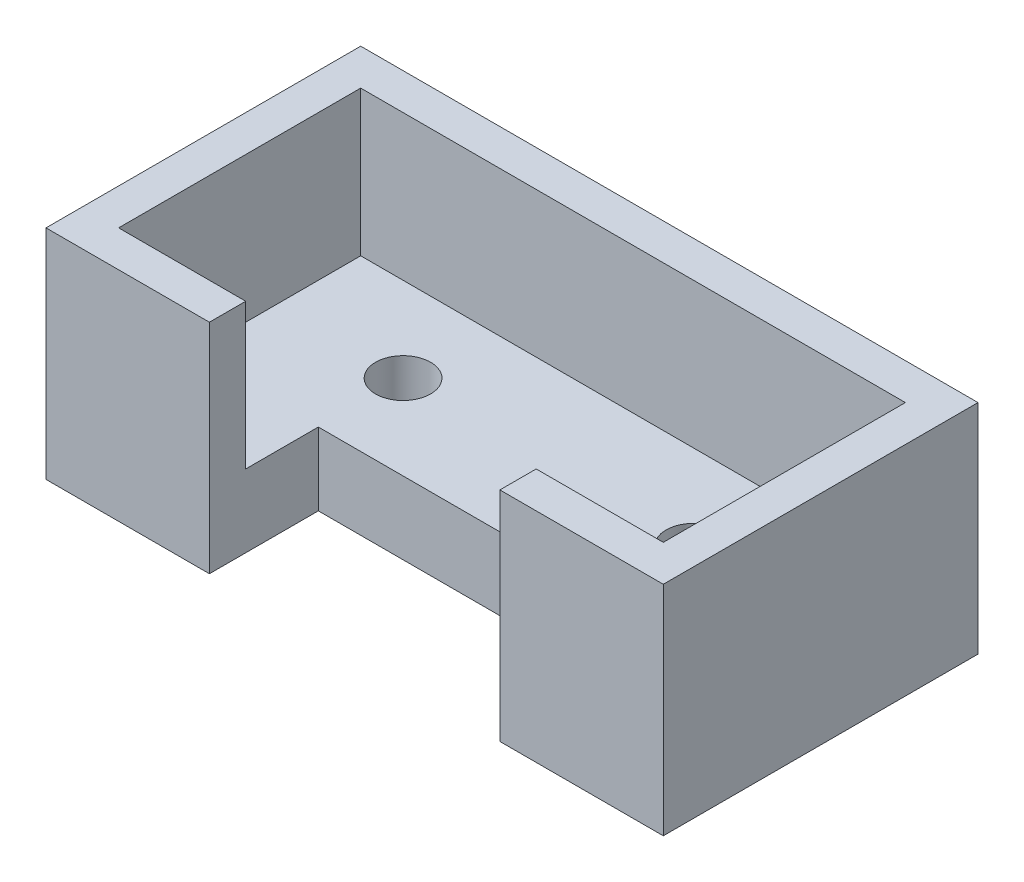
ISO-10303-21;
HEADER;
FILE_DESCRIPTION(('STEP AP214'),'2;1');
FILE_NAME('part.step','',(''),(''),'','','');
FILE_SCHEMA(('AUTOMOTIVE_DESIGN { 1 0 10303 214 1 1 1 1 }'));
ENDSEC;
DATA;
#1=APPLICATION_CONTEXT('core data for automotive mechanical design processes');
#2=APPLICATION_PROTOCOL_DEFINITION('international standard','automotive_design',2000,#1);
#3=PRODUCT_CONTEXT('',#1,'mechanical');
#4=PRODUCT('Part','Part','',(#3));
#5=PRODUCT_RELATED_PRODUCT_CATEGORY('part','',(#4));
#6=PRODUCT_DEFINITION_FORMATION('','',#4);
#7=PRODUCT_DEFINITION_CONTEXT('part definition',#1,'design');
#8=PRODUCT_DEFINITION('design','',#6,#7);
#9=PRODUCT_DEFINITION_SHAPE('','',#8);
#10=(LENGTH_UNIT() NAMED_UNIT(*) SI_UNIT(.MILLI.,.METRE.));
#11=(NAMED_UNIT(*) PLANE_ANGLE_UNIT() SI_UNIT($,.RADIAN.));
#12=(NAMED_UNIT(*) SI_UNIT($,.STERADIAN.) SOLID_ANGLE_UNIT());
#13=UNCERTAINTY_MEASURE_WITH_UNIT(LENGTH_MEASURE(1.E-05),#10,'distance_accuracy_value','');
#14=(GEOMETRIC_REPRESENTATION_CONTEXT(3) GLOBAL_UNCERTAINTY_ASSIGNED_CONTEXT((#13)) GLOBAL_UNIT_ASSIGNED_CONTEXT((#10,
#11,#12)) REPRESENTATION_CONTEXT('',''));
#15=CARTESIAN_POINT('',(0.,0.,0.));
#16=DIRECTION('',(0.,0.,1.));
#17=DIRECTION('',(1.,0.,0.));
#18=AXIS2_PLACEMENT_3D('',#15,#16,#17);
#19=CARTESIAN_POINT('',(-22.6041971247564,-3.3,7.43055555555555));
#20=DIRECTION('',(0.,0.,1.));
#21=DIRECTION('',(1.,0.,0.));
#22=AXIS2_PLACEMENT_3D('',#19,#20,#21);
#23=PLANE('',#22);
#24=DIRECTION('',(1.,0.,0.));
#25=VECTOR('',#24,1.);
#26=CARTESIAN_POINT('',(-22.6041971247564,-3.3,7.43055555555555));
#27=LINE('',#26,#25);
#28=CARTESIAN_POINT('',(14.8958028752436,-3.3,7.43055555555555));
#29=VERTEX_POINT('',#28);
#30=CARTESIAN_POINT('',(25.3958028752436,-3.3,7.43055555555555));
#31=VERTEX_POINT('',#30);
#32=EDGE_CURVE('E218',#29,#31,#27,.T.);
#33=ORIENTED_EDGE('',*,*,#32,.F.);
#34=DIRECTION('',(0.,1.,0.));
#35=VECTOR('',#34,1.);
#36=CARTESIAN_POINT('',(14.8958028752436,8.70000000000001,7.43055555555555));
#37=LINE('',#36,#35);
#38=CARTESIAN_POINT('',(14.8958028752436,8.70000000000001,7.43055555555555));
#39=VERTEX_POINT('',#38);
#40=EDGE_CURVE('E51',#29,#39,#37,.T.);
#41=ORIENTED_EDGE('',*,*,#40,.T.);
#42=DIRECTION('',(1.,0.,0.));
#43=VECTOR('',#42,1.);
#44=CARTESIAN_POINT('',(-22.6041971247564,8.7,7.43055555555555));
#45=LINE('',#44,#43);
#46=CARTESIAN_POINT('',(25.3958028752436,8.7,7.43055555555555));
#47=VERTEX_POINT('',#46);
#48=EDGE_CURVE('E223',#39,#47,#45,.T.);
#49=ORIENTED_EDGE('',*,*,#48,.T.);
#50=DIRECTION('',(0.,-1.,0.));
#51=VECTOR('',#50,1.);
#52=CARTESIAN_POINT('',(25.3958028752436,-3.3,7.43055555555555));
#53=LINE('',#52,#51);
#54=EDGE_CURVE('E58',#47,#31,#53,.T.);
#55=ORIENTED_EDGE('',*,*,#54,.T.);
#56=EDGE_LOOP('',(#33,#41,#49,#55));
#57=FACE_BOUND('',#56,.T.);
#58=ADVANCED_FACE('F36',(#57),#23,.F.);
#59=CARTESIAN_POINT('',(28.3958028752436,-3.3,10.4305555555556));
#60=DIRECTION('',(0.,0.,-1.));
#61=DIRECTION('',(-1.,0.,0.));
#62=AXIS2_PLACEMENT_3D('',#59,#60,#61);
#63=PLANE('',#62);
#64=DIRECTION('',(-1.,0.,0.));
#65=VECTOR('',#64,1.);
#66=CARTESIAN_POINT('',(28.3958028752436,8.7,10.4305555555556));
#67=LINE('',#66,#65);
#68=CARTESIAN_POINT('',(28.3958028752436,8.7,10.4305555555556));
#69=VERTEX_POINT('',#68);
#70=CARTESIAN_POINT('',(14.8958028752436,8.70000000000001,10.4305555555556));
#71=VERTEX_POINT('',#70);
#72=EDGE_CURVE('E44',#69,#71,#67,.T.);
#73=ORIENTED_EDGE('',*,*,#72,.T.);
#74=DIRECTION('',(0.,1.,0.));
#75=VECTOR('',#74,1.);
#76=CARTESIAN_POINT('',(14.8958028752436,8.70000000000001,10.4305555555556));
#77=LINE('',#76,#75);
#78=CARTESIAN_POINT('',(14.8958028752436,-9.3,10.4305555555556));
#79=VERTEX_POINT('',#78);
#80=EDGE_CURVE('E196',#79,#71,#77,.T.);
#81=ORIENTED_EDGE('',*,*,#80,.F.);
#82=DIRECTION('',(1.,0.,0.));
#83=VECTOR('',#82,1.);
#84=CARTESIAN_POINT('',(0.,-9.3,10.4305555555556));
#85=LINE('',#84,#83);
#86=CARTESIAN_POINT('',(28.3958028752436,-9.3,10.4305555555556));
#87=VERTEX_POINT('',#86);
#88=EDGE_CURVE('E162',#79,#87,#85,.T.);
#89=ORIENTED_EDGE('',*,*,#88,.T.);
#90=DIRECTION('',(0.,-1.,0.));
#91=VECTOR('',#90,1.);
#92=CARTESIAN_POINT('',(28.3958028752436,-3.3,10.4305555555556));
#93=LINE('',#92,#91);
#94=EDGE_CURVE('E161',#69,#87,#93,.T.);
#95=ORIENTED_EDGE('',*,*,#94,.F.);
#96=EDGE_LOOP('',(#73,#81,#89,#95));
#97=FACE_BOUND('',#96,.T.);
#98=ADVANCED_FACE('F274',(#97),#63,.F.);
#99=CARTESIAN_POINT('',(-22.6041971247564,-3.3,-12.5694444444444));
#100=DIRECTION('',(0.,0.,-1.));
#101=DIRECTION('',(-1.,0.,0.));
#102=AXIS2_PLACEMENT_3D('',#99,#100,#101);
#103=PLANE('',#102);
#104=DIRECTION('',(0.,1.,0.));
#105=VECTOR('',#104,1.);
#106=CARTESIAN_POINT('',(-19.6041971247563,-3.3,-12.5694444444444));
#107=LINE('',#106,#105);
#108=CARTESIAN_POINT('',(-19.6041971247563,-3.3,-12.5694444444444));
#109=VERTEX_POINT('',#108);
#110=CARTESIAN_POINT('',(-19.6041971247563,8.7,-12.5694444444444));
#111=VERTEX_POINT('',#110);
#112=EDGE_CURVE('E204',#109,#111,#107,.T.);
#113=ORIENTED_EDGE('',*,*,#112,.F.);
#114=DIRECTION('',(1.,0.,0.));
#115=VECTOR('',#114,1.);
#116=CARTESIAN_POINT('',(-22.6041971247564,-3.3,-12.5694444444444));
#117=LINE('',#116,#115);
#118=CARTESIAN_POINT('',(25.3958028752436,-3.30000000000001,-12.5694444444444));
#119=VERTEX_POINT('',#118);
#120=EDGE_CURVE('E237',#109,#119,#117,.T.);
#121=ORIENTED_EDGE('',*,*,#120,.T.);
#122=DIRECTION('',(0.,1.,0.));
#123=VECTOR('',#122,1.);
#124=CARTESIAN_POINT('',(25.3958028752436,-3.3,-12.5694444444444));
#125=LINE('',#124,#123);
#126=CARTESIAN_POINT('',(25.3958028752436,8.7,-12.5694444444444));
#127=VERTEX_POINT('',#126);
#128=EDGE_CURVE('E227',#119,#127,#125,.T.);
#129=ORIENTED_EDGE('',*,*,#128,.T.);
#130=DIRECTION('',(1.,0.,0.));
#131=VECTOR('',#130,1.);
#132=CARTESIAN_POINT('',(-22.6041971247564,8.7,-12.5694444444444));
#133=LINE('',#132,#131);
#134=EDGE_CURVE('E233',#111,#127,#133,.T.);
#135=ORIENTED_EDGE('',*,*,#134,.F.);
#136=EDGE_LOOP('',(#113,#121,#129,#135));
#137=FACE_BOUND('',#136,.T.);
#138=ADVANCED_FACE('F279',(#137),#103,.F.);
#139=CARTESIAN_POINT('',(-19.6041971247563,8.7,7.43055555557248));
#140=VERTEX_POINT('',#139);
#141=CARTESIAN_POINT('',(-9.10419712475635,8.7,7.43055555555555));
#142=VERTEX_POINT('',#141);
#143=EDGE_CURVE('E224',#140,#142,#45,.T.);
#144=ORIENTED_EDGE('',*,*,#143,.T.);
#145=DIRECTION('',(0.,-1.,0.));
#146=VECTOR('',#145,1.);
#147=CARTESIAN_POINT('',(-9.10419712475635,-3.3,7.43055555555555));
#148=LINE('',#147,#146);
#149=CARTESIAN_POINT('',(-9.10419712475635,-3.3,7.43055555556402));
#150=VERTEX_POINT('',#149);
#151=EDGE_CURVE('E194',#142,#150,#148,.T.);
#152=ORIENTED_EDGE('',*,*,#151,.T.);
#153=CARTESIAN_POINT('',(-19.6041971247563,-3.3,7.43055555557248));
#154=VERTEX_POINT('',#153);
#155=EDGE_CURVE('E220',#154,#150,#27,.T.);
#156=ORIENTED_EDGE('',*,*,#155,.F.);
#157=DIRECTION('',(0.,1.,0.));
#158=VECTOR('',#157,1.);
#159=CARTESIAN_POINT('',(-19.6041971247563,-3.3,7.43055555557248));
#160=LINE('',#159,#158);
#161=EDGE_CURVE('E211',#154,#140,#160,.T.);
#162=ORIENTED_EDGE('',*,*,#161,.T.);
#163=EDGE_LOOP('',(#144,#152,#156,#162));
#164=FACE_BOUND('',#163,.T.);
#165=ADVANCED_FACE('F275',(#164),#23,.F.);
#166=CARTESIAN_POINT('',(25.3958028752436,0.,0.));
#167=DIRECTION('',(-1.,0.,0.));
#168=DIRECTION('',(0.,0.,1.));
#169=AXIS2_PLACEMENT_3D('',#166,#167,#168);
#170=PLANE('',#169);
#171=DIRECTION('',(0.,0.,-1.));
#172=VECTOR('',#171,1.);
#173=CARTESIAN_POINT('',(25.3958028752436,-3.3,7.43055555555555));
#174=LINE('',#173,#172);
#175=EDGE_CURVE('E146',#31,#119,#174,.T.);
#176=ORIENTED_EDGE('',*,*,#175,.F.);
#177=ORIENTED_EDGE('',*,*,#54,.F.);
#178=DIRECTION('',(0.,0.,1.));
#179=VECTOR('',#178,1.);
#180=CARTESIAN_POINT('',(25.3958028752436,8.7,10.4305555555556));
#181=LINE('',#180,#179);
#182=EDGE_CURVE('E238',#127,#47,#181,.T.);
#183=ORIENTED_EDGE('',*,*,#182,.F.);
#184=ORIENTED_EDGE('',*,*,#128,.F.);
#185=EDGE_LOOP('',(#176,#177,#183,#184));
#186=FACE_BOUND('',#185,.T.);
#187=ADVANCED_FACE('F282',(#186),#170,.T.);
#188=CARTESIAN_POINT('',(28.3958028752436,-3.3,-15.5694444444444));
#189=DIRECTION('',(0.,0.,1.));
#190=DIRECTION('',(1.,0.,0.));
#191=AXIS2_PLACEMENT_3D('',#188,#189,#190);
#192=PLANE('',#191);
#193=DIRECTION('',(0.,1.,0.));
#194=VECTOR('',#193,1.);
#195=CARTESIAN_POINT('',(28.3958028752436,-3.3,-15.5694444444444));
#196=LINE('',#195,#194);
#197=CARTESIAN_POINT('',(28.3958028752436,-9.3,-15.5694444444444));
#198=VERTEX_POINT('',#197);
#199=CARTESIAN_POINT('',(28.3958028752436,8.7,-15.5694444444444));
#200=VERTEX_POINT('',#199);
#201=EDGE_CURVE('E137',#198,#200,#196,.T.);
#202=ORIENTED_EDGE('',*,*,#201,.F.);
#203=DIRECTION('',(-1.,0.,0.));
#204=VECTOR('',#203,1.);
#205=CARTESIAN_POINT('',(0.,-9.3,-15.5694444444444));
#206=LINE('',#205,#204);
#207=CARTESIAN_POINT('',(-22.6041971247564,-9.3,-15.5694444444444));
#208=VERTEX_POINT('',#207);
#209=EDGE_CURVE('E140',#198,#208,#206,.T.);
#210=ORIENTED_EDGE('',*,*,#209,.T.);
#211=DIRECTION('',(0.,-1.,0.));
#212=VECTOR('',#211,1.);
#213=CARTESIAN_POINT('',(-22.6041971247564,8.7,-15.5694444444444));
#214=LINE('',#213,#212);
#215=CARTESIAN_POINT('',(-22.6041971247564,8.7,-15.5694444444444));
#216=VERTEX_POINT('',#215);
#217=EDGE_CURVE('E231',#216,#208,#214,.T.);
#218=ORIENTED_EDGE('',*,*,#217,.F.);
#219=DIRECTION('',(-1.,0.,0.));
#220=VECTOR('',#219,1.);
#221=CARTESIAN_POINT('',(28.3958028752436,8.7,-15.5694444444444));
#222=LINE('',#221,#220);
#223=EDGE_CURVE('E11',#200,#216,#222,.T.);
#224=ORIENTED_EDGE('',*,*,#223,.F.);
#225=EDGE_LOOP('',(#202,#210,#218,#224));
#226=FACE_BOUND('',#225,.T.);
#227=ADVANCED_FACE('F38',(#226),#192,.F.);
#228=CARTESIAN_POINT('',(28.3958028752436,8.7,10.4305555555556));
#229=DIRECTION('',(0.,-1.,0.));
#230=DIRECTION('',(0.,0.,-1.));
#231=AXIS2_PLACEMENT_3D('',#228,#229,#230);
#232=PLANE('',#231);
#233=ORIENTED_EDGE('',*,*,#48,.F.);
#234=DIRECTION('',(0.,0.,1.));
#235=VECTOR('',#234,1.);
#236=CARTESIAN_POINT('',(14.8958028752436,8.70000000000001,7.43055555555555));
#237=LINE('',#236,#235);
#238=EDGE_CURVE('E201',#39,#71,#237,.T.);
#239=ORIENTED_EDGE('',*,*,#238,.T.);
#240=ORIENTED_EDGE('',*,*,#72,.F.);
#241=DIRECTION('',(0.,0.,1.));
#242=VECTOR('',#241,1.);
#243=CARTESIAN_POINT('',(28.3958028752436,8.7,-15.5694444444444));
#244=LINE('',#243,#242);
#245=EDGE_CURVE('E145',#200,#69,#244,.T.);
#246=ORIENTED_EDGE('',*,*,#245,.F.);
#247=ORIENTED_EDGE('',*,*,#223,.T.);
#248=DIRECTION('',(0.,0.,-1.));
#249=VECTOR('',#248,1.);
#250=CARTESIAN_POINT('',(-22.6041971247564,8.7,-12.5694444444444));
#251=LINE('',#250,#249);
#252=CARTESIAN_POINT('',(-22.6041971247564,8.7,10.4305555555556));
#253=VERTEX_POINT('',#252);
#254=EDGE_CURVE('E228',#253,#216,#251,.T.);
#255=ORIENTED_EDGE('',*,*,#254,.F.);
#256=CARTESIAN_POINT('',(-9.10419712475635,8.7,10.4305555555556));
#257=VERTEX_POINT('',#256);
#258=EDGE_CURVE('E242',#257,#253,#67,.T.);
#259=ORIENTED_EDGE('',*,*,#258,.F.);
#260=DIRECTION('',(0.,0.,1.));
#261=VECTOR('',#260,1.);
#262=CARTESIAN_POINT('',(-9.10419712475635,8.7,7.43055555555555));
#263=LINE('',#262,#261);
#264=EDGE_CURVE('E198',#142,#257,#263,.T.);
#265=ORIENTED_EDGE('',*,*,#264,.F.);
#266=ORIENTED_EDGE('',*,*,#143,.F.);
#267=DIRECTION('',(0.,0.,-1.));
#268=VECTOR('',#267,1.);
#269=CARTESIAN_POINT('',(-19.6041971247563,8.7,500000.));
#270=LINE('',#269,#268);
#271=EDGE_CURVE('E208',#140,#111,#270,.T.);
#272=ORIENTED_EDGE('',*,*,#271,.T.);
#273=ORIENTED_EDGE('',*,*,#134,.T.);
#274=ORIENTED_EDGE('',*,*,#182,.T.);
#275=EDGE_LOOP('',(#233,#239,#240,#246,#247,#255,#259,#265,#266,#272,#273,#274));
#276=FACE_BOUND('',#275,.T.);
#277=ADVANCED_FACE('F257',(#276),#232,.F.);
#278=DIRECTION('',(0.,1.,0.));
#279=VECTOR('',#278,1.);
#280=CARTESIAN_POINT('',(-22.6041971247564,8.7,10.4305555555556));
#281=LINE('',#280,#279);
#282=CARTESIAN_POINT('',(-22.6041971247564,-9.3,10.4305555555556));
#283=VERTEX_POINT('',#282);
#284=EDGE_CURVE('E215',#283,#253,#281,.T.);
#285=ORIENTED_EDGE('',*,*,#284,.F.);
#286=DIRECTION('',(1.,0.,0.));
#287=VECTOR('',#286,1.);
#288=CARTESIAN_POINT('',(0.,-9.3,10.4305555555556));
#289=LINE('',#288,#287);
#290=CARTESIAN_POINT('',(-9.10419712475635,-9.3,10.4305555555556));
#291=VERTEX_POINT('',#290);
#292=EDGE_CURVE('E176',#283,#291,#289,.T.);
#293=ORIENTED_EDGE('',*,*,#292,.T.);
#294=DIRECTION('',(0.,-1.,0.));
#295=VECTOR('',#294,1.);
#296=CARTESIAN_POINT('',(-9.10419712475635,-3.3,10.4305555555556));
#297=LINE('',#296,#295);
#298=EDGE_CURVE('E193',#257,#291,#297,.T.);
#299=ORIENTED_EDGE('',*,*,#298,.F.);
#300=ORIENTED_EDGE('',*,*,#258,.T.);
#301=EDGE_LOOP('',(#285,#293,#299,#300));
#302=FACE_BOUND('',#301,.T.);
#303=ADVANCED_FACE('F253',(#302),#63,.F.);
#304=CARTESIAN_POINT('',(28.3958028752436,0.,0.));
#305=DIRECTION('',(-1.,0.,0.));
#306=DIRECTION('',(0.,0.,1.));
#307=AXIS2_PLACEMENT_3D('',#304,#305,#306);
#308=PLANE('',#307);
#309=ORIENTED_EDGE('',*,*,#94,.T.);
#310=DIRECTION('',(0.,0.,-1.));
#311=VECTOR('',#310,1.);
#312=CARTESIAN_POINT('',(28.3958028752436,-9.3,0.));
#313=LINE('',#312,#311);
#314=EDGE_CURVE('E152',#87,#198,#313,.T.);
#315=ORIENTED_EDGE('',*,*,#314,.T.);
#316=ORIENTED_EDGE('',*,*,#201,.T.);
#317=ORIENTED_EDGE('',*,*,#245,.T.);
#318=EDGE_LOOP('',(#309,#315,#316,#317));
#319=FACE_BOUND('',#318,.T.);
#320=ADVANCED_FACE('F159',(#319),#308,.F.);
#321=CARTESIAN_POINT('',(-22.6041971247564,0.,0.));
#322=DIRECTION('',(-1.,0.,0.));
#323=DIRECTION('',(0.,0.,1.));
#324=AXIS2_PLACEMENT_3D('',#321,#322,#323);
#325=PLANE('',#324);
#326=ORIENTED_EDGE('',*,*,#254,.T.);
#327=ORIENTED_EDGE('',*,*,#217,.T.);
#328=DIRECTION('',(0.,0.,1.));
#329=VECTOR('',#328,1.);
#330=CARTESIAN_POINT('',(-22.6041971247564,-9.3,0.));
#331=LINE('',#330,#329);
#332=EDGE_CURVE('E156',#208,#283,#331,.T.);
#333=ORIENTED_EDGE('',*,*,#332,.T.);
#334=ORIENTED_EDGE('',*,*,#284,.T.);
#335=EDGE_LOOP('',(#326,#327,#333,#334));
#336=FACE_BOUND('',#335,.T.);
#337=ADVANCED_FACE('F259',(#336),#325,.T.);
#338=CARTESIAN_POINT('',(-19.6041971247563,-3.3,500000.));
#339=DIRECTION('',(-1.,0.,0.));
#340=DIRECTION('',(0.,0.,1.));
#341=AXIS2_PLACEMENT_3D('',#338,#339,#340);
#342=PLANE('',#341);
#343=ORIENTED_EDGE('',*,*,#161,.F.);
#344=DIRECTION('',(0.,0.,-1.));
#345=VECTOR('',#344,1.);
#346=CARTESIAN_POINT('',(-19.6041971247563,-3.3,500000.));
#347=LINE('',#346,#345);
#348=EDGE_CURVE('E209',#154,#109,#347,.T.);
#349=ORIENTED_EDGE('',*,*,#348,.T.);
#350=ORIENTED_EDGE('',*,*,#112,.T.);
#351=ORIENTED_EDGE('',*,*,#271,.F.);
#352=EDGE_LOOP('',(#343,#349,#350,#351));
#353=FACE_BOUND('',#352,.T.);
#354=ADVANCED_FACE('F261',(#353),#342,.F.);
#355=CARTESIAN_POINT('',(-9.10419712475635,-3.3,7.43055555555555));
#356=DIRECTION('',(-1.,0.,0.));
#357=DIRECTION('',(0.,0.,1.));
#358=AXIS2_PLACEMENT_3D('',#355,#356,#357);
#359=PLANE('',#358);
#360=ORIENTED_EDGE('',*,*,#298,.T.);
#361=DIRECTION('',(0.,0.,-1.));
#362=VECTOR('',#361,1.);
#363=CARTESIAN_POINT('',(-9.10419712475634,-9.3,0.));
#364=LINE('',#363,#362);
#365=CARTESIAN_POINT('',(-9.10419712475635,-9.3,1.43055555555555));
#366=VERTEX_POINT('',#365);
#367=EDGE_CURVE('E173',#291,#366,#364,.T.);
#368=ORIENTED_EDGE('',*,*,#367,.T.);
#369=DIRECTION('',(0.,1.,0.));
#370=VECTOR('',#369,1.);
#371=CARTESIAN_POINT('',(-9.10419712475635,-9.3,1.43055555555555));
#372=LINE('',#371,#370);
#373=CARTESIAN_POINT('',(-9.10419712475635,-3.3,1.43055555555555));
#374=VERTEX_POINT('',#373);
#375=EDGE_CURVE('E180',#366,#374,#372,.T.);
#376=ORIENTED_EDGE('',*,*,#375,.T.);
#377=DIRECTION('',(0.,0.,-1.));
#378=VECTOR('',#377,1.);
#379=CARTESIAN_POINT('',(-9.10419712475634,-3.3,0.));
#380=LINE('',#379,#378);
#381=EDGE_CURVE('E157',#150,#374,#380,.T.);
#382=ORIENTED_EDGE('',*,*,#381,.F.);
#383=ORIENTED_EDGE('',*,*,#151,.F.);
#384=ORIENTED_EDGE('',*,*,#264,.T.);
#385=EDGE_LOOP('',(#360,#368,#376,#382,#383,#384));
#386=FACE_BOUND('',#385,.T.);
#387=ADVANCED_FACE('F267',(#386),#359,.F.);
#388=CARTESIAN_POINT('',(14.8958028752436,8.70000000000001,7.43055555555555));
#389=DIRECTION('',(1.,0.,0.));
#390=DIRECTION('',(0.,1.,0.));
#391=AXIS2_PLACEMENT_3D('',#388,#389,#390);
#392=PLANE('',#391);
#393=ORIENTED_EDGE('',*,*,#80,.T.);
#394=ORIENTED_EDGE('',*,*,#238,.F.);
#395=ORIENTED_EDGE('',*,*,#40,.F.);
#396=DIRECTION('',(0.,0.,1.));
#397=VECTOR('',#396,1.);
#398=CARTESIAN_POINT('',(14.8958028752436,-3.3,0.));
#399=LINE('',#398,#397);
#400=CARTESIAN_POINT('',(14.8958028752437,-3.3,1.43055555555555));
#401=VERTEX_POINT('',#400);
#402=EDGE_CURVE('E181',#401,#29,#399,.T.);
#403=ORIENTED_EDGE('',*,*,#402,.F.);
#404=DIRECTION('',(0.,1.,0.));
#405=VECTOR('',#404,1.);
#406=CARTESIAN_POINT('',(14.8958028752437,-9.3,1.43055555555555));
#407=LINE('',#406,#405);
#408=CARTESIAN_POINT('',(14.8958028752437,-9.3,1.43055555555555));
#409=VERTEX_POINT('',#408);
#410=EDGE_CURVE('E191',#409,#401,#407,.T.);
#411=ORIENTED_EDGE('',*,*,#410,.F.);
#412=DIRECTION('',(0.,0.,1.));
#413=VECTOR('',#412,1.);
#414=CARTESIAN_POINT('',(14.8958028752436,-9.3,0.));
#415=LINE('',#414,#413);
#416=EDGE_CURVE('E164',#409,#79,#415,.T.);
#417=ORIENTED_EDGE('',*,*,#416,.T.);
#418=EDGE_LOOP('',(#393,#394,#395,#403,#411,#417));
#419=FACE_BOUND('',#418,.T.);
#420=ADVANCED_FACE('F306',(#419),#392,.F.);
#421=CARTESIAN_POINT('',(0.,-3.3,0.));
#422=DIRECTION('',(0.,-1.,0.));
#423=DIRECTION('',(0.,0.,-1.));
#424=AXIS2_PLACEMENT_3D('',#421,#422,#423);
#425=PLANE('',#424);
#426=CARTESIAN_POINT('',(14.8958028752437,-3.3,-5.56944444444445));
#427=DIRECTION('',(0.,1.,0.));
#428=DIRECTION('',(0.,0.,1.));
#429=AXIS2_PLACEMENT_3D('',#426,#427,#428);
#430=CIRCLE('',#429,2.2733);
#431=CARTESIAN_POINT('',(14.8958028752437,-3.3,-3.29614444444445));
#432=VERTEX_POINT('',#431);
#433=EDGE_CURVE('E375',#432,#432,#430,.T.);
#434=ORIENTED_EDGE('',*,*,#433,.F.);
#435=EDGE_LOOP('',(#434));
#436=FACE_BOUND('',#435,.T.);
#437=CARTESIAN_POINT('',(-9.10419712475634,-3.3,-5.56944444444444));
#438=DIRECTION('',(0.,1.,0.));
#439=DIRECTION('',(0.,0.,1.));
#440=AXIS2_PLACEMENT_3D('',#437,#438,#439);
#441=CIRCLE('',#440,2.2733);
#442=CARTESIAN_POINT('',(-9.10419712475634,-3.3,-3.29614444444444));
#443=VERTEX_POINT('',#442);
#444=EDGE_CURVE('E185',#443,#443,#441,.T.);
#445=ORIENTED_EDGE('',*,*,#444,.F.);
#446=EDGE_LOOP('',(#445));
#447=FACE_BOUND('',#446,.T.);
#448=ORIENTED_EDGE('',*,*,#402,.T.);
#449=ORIENTED_EDGE('',*,*,#32,.T.);
#450=ORIENTED_EDGE('',*,*,#175,.T.);
#451=ORIENTED_EDGE('',*,*,#120,.F.);
#452=ORIENTED_EDGE('',*,*,#348,.F.);
#453=ORIENTED_EDGE('',*,*,#155,.T.);
#454=ORIENTED_EDGE('',*,*,#381,.T.);
#455=DIRECTION('',(1.,0.,0.));
#456=VECTOR('',#455,1.);
#457=CARTESIAN_POINT('',(0.,-3.3,1.43055555555555));
#458=LINE('',#457,#456);
#459=EDGE_CURVE('E184',#374,#401,#458,.T.);
#460=ORIENTED_EDGE('',*,*,#459,.T.);
#461=EDGE_LOOP('',(#448,#449,#450,#451,#452,#453,#454,#460));
#462=FACE_BOUND('',#461,.T.);
#463=ADVANCED_FACE('F298',(#436,#447,#462),#425,.F.);
#464=CARTESIAN_POINT('',(0.,-9.3,1.43055555555555));
#465=DIRECTION('',(0.,0.,1.));
#466=DIRECTION('',(1.,0.,0.));
#467=AXIS2_PLACEMENT_3D('',#464,#465,#466);
#468=PLANE('',#467);
#469=ORIENTED_EDGE('',*,*,#459,.F.);
#470=ORIENTED_EDGE('',*,*,#375,.F.);
#471=DIRECTION('',(1.,0.,0.));
#472=VECTOR('',#471,1.);
#473=CARTESIAN_POINT('',(0.,-9.3,1.43055555555555));
#474=LINE('',#473,#472);
#475=EDGE_CURVE('E170',#366,#409,#474,.T.);
#476=ORIENTED_EDGE('',*,*,#475,.T.);
#477=ORIENTED_EDGE('',*,*,#410,.T.);
#478=EDGE_LOOP('',(#469,#470,#476,#477));
#479=FACE_BOUND('',#478,.T.);
#480=ADVANCED_FACE('F310',(#479),#468,.T.);
#481=CARTESIAN_POINT('',(0.,-9.3,0.));
#482=DIRECTION('',(0.,-1.,0.));
#483=DIRECTION('',(0.,0.,-1.));
#484=AXIS2_PLACEMENT_3D('',#481,#482,#483);
#485=PLANE('',#484);
#486=CARTESIAN_POINT('',(14.8958028752437,-9.3,-5.56944444444445));
#487=DIRECTION('',(0.,-1.,0.));
#488=DIRECTION('',(0.,0.,-1.));
#489=AXIS2_PLACEMENT_3D('',#486,#487,#488);
#490=CIRCLE('',#489,2.2733);
#491=CARTESIAN_POINT('',(14.8958028752437,-9.3,-7.84274444444445));
#492=VERTEX_POINT('',#491);
#493=EDGE_CURVE('E372',#492,#492,#490,.F.);
#494=ORIENTED_EDGE('',*,*,#493,.T.);
#495=EDGE_LOOP('',(#494));
#496=FACE_BOUND('',#495,.T.);
#497=CARTESIAN_POINT('',(-9.10419712475634,-9.3,-5.56944444444444));
#498=DIRECTION('',(0.,-1.,0.));
#499=DIRECTION('',(0.,0.,-1.));
#500=AXIS2_PLACEMENT_3D('',#497,#498,#499);
#501=CIRCLE('',#500,2.2733);
#502=CARTESIAN_POINT('',(-9.10419712475634,-9.3,-7.84274444444444));
#503=VERTEX_POINT('',#502);
#504=EDGE_CURVE('E376',#503,#503,#501,.F.);
#505=ORIENTED_EDGE('',*,*,#504,.T.);
#506=EDGE_LOOP('',(#505));
#507=FACE_BOUND('',#506,.T.);
#508=ORIENTED_EDGE('',*,*,#209,.F.);
#509=ORIENTED_EDGE('',*,*,#314,.F.);
#510=ORIENTED_EDGE('',*,*,#88,.F.);
#511=ORIENTED_EDGE('',*,*,#416,.F.);
#512=ORIENTED_EDGE('',*,*,#475,.F.);
#513=ORIENTED_EDGE('',*,*,#367,.F.);
#514=ORIENTED_EDGE('',*,*,#292,.F.);
#515=ORIENTED_EDGE('',*,*,#332,.F.);
#516=EDGE_LOOP('',(#508,#509,#510,#511,#512,#513,#514,#515));
#517=FACE_BOUND('',#516,.T.);
#518=ADVANCED_FACE('F150',(#496,#507,#517),#485,.T.);
#519=CARTESIAN_POINT('',(-9.10419712475634,-9.301,-5.56944444444444));
#520=DIRECTION('',(0.,1.,0.));
#521=DIRECTION('',(0.,0.,1.));
#522=AXIS2_PLACEMENT_3D('',#519,#520,#521);
#523=CYLINDRICAL_SURFACE('',#522,2.2733);
#524=ORIENTED_EDGE('',*,*,#504,.F.);
#525=EDGE_LOOP('',(#524));
#526=FACE_BOUND('',#525,.T.);
#527=ORIENTED_EDGE('',*,*,#444,.T.);
#528=EDGE_LOOP('',(#527));
#529=FACE_BOUND('',#528,.T.);
#530=ADVANCED_FACE('F317',(#526,#529),#523,.F.);
#531=CARTESIAN_POINT('',(14.8958028752437,-9.301,-5.56944444444445));
#532=DIRECTION('',(0.,1.,0.));
#533=DIRECTION('',(0.,0.,1.));
#534=AXIS2_PLACEMENT_3D('',#531,#532,#533);
#535=CYLINDRICAL_SURFACE('',#534,2.2733);
#536=ORIENTED_EDGE('',*,*,#493,.F.);
#537=EDGE_LOOP('',(#536));
#538=FACE_BOUND('',#537,.T.);
#539=ORIENTED_EDGE('',*,*,#433,.T.);
#540=EDGE_LOOP('',(#539));
#541=FACE_BOUND('',#540,.T.);
#542=ADVANCED_FACE('F355',(#538,#541),#535,.F.);
#543=CLOSED_SHELL('',(#58,#98,#138,#165,#187,#227,#277,#303,#320,#337,#354,#387,#420,#463,#480,
#518,#530,#542));
#544=MANIFOLD_SOLID_BREP('B2',#543);
#545=ADVANCED_BREP_SHAPE_REPRESENTATION('',(#18,#544),#14);
#546=SHAPE_DEFINITION_REPRESENTATION(#9,#545);
ENDSEC;
END-ISO-10303-21;
